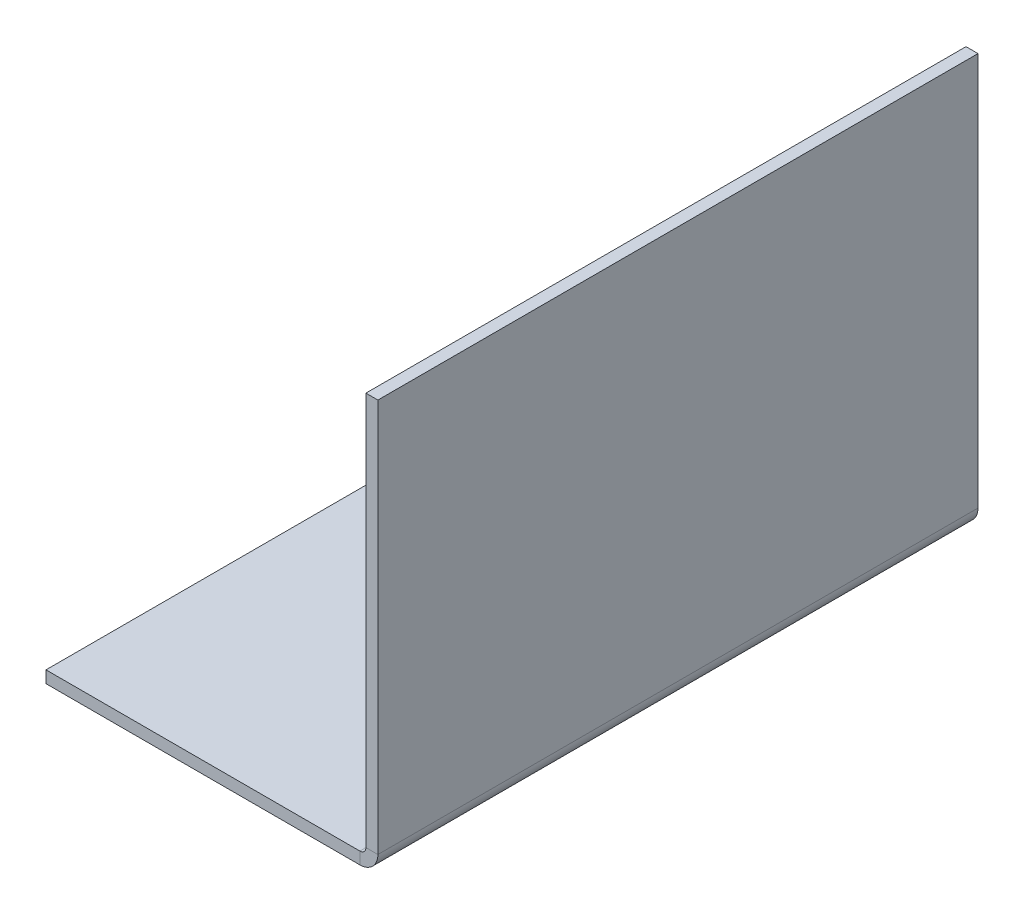
ISO-10303-21;
HEADER;
FILE_DESCRIPTION(('STEP AP214'),'2;1');
FILE_NAME('part.step','',(''),(''),'','','');
FILE_SCHEMA(('AUTOMOTIVE_DESIGN { 1 0 10303 214 1 1 1 1 }'));
ENDSEC;
DATA;
#1=APPLICATION_CONTEXT('core data for automotive mechanical design processes');
#2=APPLICATION_PROTOCOL_DEFINITION('international standard','automotive_design',2000,#1);
#3=PRODUCT_CONTEXT('',#1,'mechanical');
#4=PRODUCT('Part','Part','',(#3));
#5=PRODUCT_RELATED_PRODUCT_CATEGORY('part','',(#4));
#6=PRODUCT_DEFINITION_FORMATION('','',#4);
#7=PRODUCT_DEFINITION_CONTEXT('part definition',#1,'design');
#8=PRODUCT_DEFINITION('design','',#6,#7);
#9=PRODUCT_DEFINITION_SHAPE('','',#8);
#10=(LENGTH_UNIT() NAMED_UNIT(*) SI_UNIT(.MILLI.,.METRE.));
#11=(NAMED_UNIT(*) PLANE_ANGLE_UNIT() SI_UNIT($,.RADIAN.));
#12=(NAMED_UNIT(*) SI_UNIT($,.STERADIAN.) SOLID_ANGLE_UNIT());
#13=UNCERTAINTY_MEASURE_WITH_UNIT(LENGTH_MEASURE(1.E-05),#10,'distance_accuracy_value','');
#14=(GEOMETRIC_REPRESENTATION_CONTEXT(3) GLOBAL_UNCERTAINTY_ASSIGNED_CONTEXT((#13)) GLOBAL_UNIT_ASSIGNED_CONTEXT((#10,
#11,#12)) REPRESENTATION_CONTEXT('',''));
#15=CARTESIAN_POINT('',(0.,0.,0.));
#16=DIRECTION('',(0.,0.,1.));
#17=DIRECTION('',(1.,0.,0.));
#18=AXIS2_PLACEMENT_3D('',#15,#16,#17);
#19=CARTESIAN_POINT('',(0.,0.,100.));
#20=DIRECTION('',(0.,0.,-1.));
#21=DIRECTION('',(0.,1.,0.));
#22=AXIS2_PLACEMENT_3D('',#19,#20,#21);
#23=PLANE('',#22);
#24=DIRECTION('',(-1.,0.,0.));
#25=VECTOR('',#24,1.);
#26=CARTESIAN_POINT('',(0.,1.,100.));
#27=LINE('',#26,#25);
#28=CARTESIAN_POINT('',(2.,1.,100.));
#29=VERTEX_POINT('',#28);
#30=CARTESIAN_POINT('',(0.,1.,100.));
#31=VERTEX_POINT('',#30);
#32=EDGE_CURVE('E11',#29,#31,#27,.T.);
#33=ORIENTED_EDGE('',*,*,#32,.F.);
#34=DIRECTION('',(0.,1.,0.));
#35=VECTOR('',#34,1.);
#36=CARTESIAN_POINT('',(2.,0.,100.));
#37=LINE('',#36,#35);
#38=CARTESIAN_POINT('',(2.,66.585525727806,100.));
#39=VERTEX_POINT('',#38);
#40=EDGE_CURVE('E90',#29,#39,#37,.T.);
#41=ORIENTED_EDGE('',*,*,#40,.T.);
#42=DIRECTION('',(-1.,0.,0.));
#43=VECTOR('',#42,1.);
#44=CARTESIAN_POINT('',(0.,66.585525727806,100.));
#45=LINE('',#44,#43);
#46=CARTESIAN_POINT('',(0.,66.585525727806,100.));
#47=VERTEX_POINT('',#46);
#48=EDGE_CURVE('E50',#39,#47,#45,.T.);
#49=ORIENTED_EDGE('',*,*,#48,.T.);
#50=DIRECTION('',(0.,1.,0.));
#51=VECTOR('',#50,1.);
#52=CARTESIAN_POINT('',(0.,0.,100.));
#53=LINE('',#52,#51);
#54=EDGE_CURVE('E93',#31,#47,#53,.T.);
#55=ORIENTED_EDGE('',*,*,#54,.F.);
#56=EDGE_LOOP('',(#33,#41,#49,#55));
#57=FACE_BOUND('',#56,.T.);
#58=ADVANCED_FACE('F40',(#57),#23,.F.);
#59=CARTESIAN_POINT('',(0.,66.585525727806,0.));
#60=DIRECTION('',(0.,1.,0.));
#61=DIRECTION('',(0.,0.,1.));
#62=AXIS2_PLACEMENT_3D('',#59,#60,#61);
#63=PLANE('',#62);
#64=ORIENTED_EDGE('',*,*,#48,.F.);
#65=DIRECTION('',(0.,0.,-1.));
#66=VECTOR('',#65,1.);
#67=CARTESIAN_POINT('',(2.,66.585525727806,0.));
#68=LINE('',#67,#66);
#69=CARTESIAN_POINT('',(2.,66.585525727806,0.));
#70=VERTEX_POINT('',#69);
#71=EDGE_CURVE('E118',#70,#39,#68,.F.);
#72=ORIENTED_EDGE('',*,*,#71,.F.);
#73=DIRECTION('',(-1.,0.,0.));
#74=VECTOR('',#73,1.);
#75=CARTESIAN_POINT('',(0.,66.585525727806,0.));
#76=LINE('',#75,#74);
#77=CARTESIAN_POINT('',(0.,66.585525727806,0.));
#78=VERTEX_POINT('',#77);
#79=EDGE_CURVE('E136',#70,#78,#76,.T.);
#80=ORIENTED_EDGE('',*,*,#79,.T.);
#81=DIRECTION('',(0.,0.,1.));
#82=VECTOR('',#81,1.);
#83=CARTESIAN_POINT('',(0.,66.585525727806,0.));
#84=LINE('',#83,#82);
#85=EDGE_CURVE('E147',#78,#47,#84,.T.);
#86=ORIENTED_EDGE('',*,*,#85,.T.);
#87=EDGE_LOOP('',(#64,#72,#80,#86));
#88=FACE_BOUND('',#87,.T.);
#89=ADVANCED_FACE('F153',(#88),#63,.T.);
#90=CARTESIAN_POINT('',(0.,0.,0.));
#91=DIRECTION('',(0.,0.,-1.));
#92=DIRECTION('',(0.,1.,0.));
#93=AXIS2_PLACEMENT_3D('',#90,#91,#92);
#94=PLANE('',#93);
#95=ORIENTED_EDGE('',*,*,#79,.F.);
#96=DIRECTION('',(0.,1.,0.));
#97=VECTOR('',#96,1.);
#98=CARTESIAN_POINT('',(2.,0.,0.));
#99=LINE('',#98,#97);
#100=CARTESIAN_POINT('',(2.,1.,0.));
#101=VERTEX_POINT('',#100);
#102=EDGE_CURVE('E178',#101,#70,#99,.T.);
#103=ORIENTED_EDGE('',*,*,#102,.F.);
#104=DIRECTION('',(-1.,0.,0.));
#105=VECTOR('',#104,1.);
#106=CARTESIAN_POINT('',(0.,1.,0.));
#107=LINE('',#106,#105);
#108=CARTESIAN_POINT('',(0.,1.,0.));
#109=VERTEX_POINT('',#108);
#110=EDGE_CURVE('E133',#101,#109,#107,.T.);
#111=ORIENTED_EDGE('',*,*,#110,.T.);
#112=DIRECTION('',(0.,1.,0.));
#113=VECTOR('',#112,1.);
#114=CARTESIAN_POINT('',(0.,0.,0.));
#115=LINE('',#114,#113);
#116=EDGE_CURVE('E154',#109,#78,#115,.T.);
#117=ORIENTED_EDGE('',*,*,#116,.T.);
#118=EDGE_LOOP('',(#95,#103,#111,#117));
#119=FACE_BOUND('',#118,.T.);
#120=ADVANCED_FACE('F184',(#119),#94,.T.);
#121=CARTESIAN_POINT('',(-1.,1.,0.));
#122=DIRECTION('',(0.,0.,-1.));
#123=DIRECTION('',(-1.,0.,0.));
#124=AXIS2_PLACEMENT_3D('',#121,#122,#123);
#125=PLANE('',#124);
#126=ORIENTED_EDGE('',*,*,#110,.F.);
#127=CARTESIAN_POINT('',(-1.,1.,0.));
#128=DIRECTION('',(0.,0.,-1.));
#129=DIRECTION('',(-1.,0.,0.));
#130=AXIS2_PLACEMENT_3D('',#127,#128,#129);
#131=CIRCLE('',#130,3.);
#132=CARTESIAN_POINT('',(-1.,-2.,0.));
#133=VERTEX_POINT('',#132);
#134=EDGE_CURVE('E108',#101,#133,#131,.T.);
#135=ORIENTED_EDGE('',*,*,#134,.T.);
#136=DIRECTION('',(0.,1.,0.));
#137=VECTOR('',#136,1.);
#138=CARTESIAN_POINT('',(-1.,0.,0.));
#139=LINE('',#138,#137);
#140=CARTESIAN_POINT('',(-1.,0.,0.));
#141=VERTEX_POINT('',#140);
#142=EDGE_CURVE('E58',#133,#141,#139,.T.);
#143=ORIENTED_EDGE('',*,*,#142,.T.);
#144=CARTESIAN_POINT('',(-1.,1.,0.));
#145=DIRECTION('',(0.,0.,1.));
#146=DIRECTION('',(1.,0.,0.));
#147=AXIS2_PLACEMENT_3D('',#144,#145,#146);
#148=CIRCLE('',#147,1.);
#149=EDGE_CURVE('E151',#109,#141,#148,.F.);
#150=ORIENTED_EDGE('',*,*,#149,.F.);
#151=EDGE_LOOP('',(#126,#135,#143,#150));
#152=FACE_BOUND('',#151,.T.);
#153=ADVANCED_FACE('F187',(#152),#125,.T.);
#154=CARTESIAN_POINT('',(-53.3038384150787,0.,0.));
#155=DIRECTION('',(0.,0.,-1.));
#156=DIRECTION('',(1.,0.,0.));
#157=AXIS2_PLACEMENT_3D('',#154,#155,#156);
#158=PLANE('',#157);
#159=ORIENTED_EDGE('',*,*,#142,.F.);
#160=DIRECTION('',(1.,0.,0.));
#161=VECTOR('',#160,1.);
#162=CARTESIAN_POINT('',(-53.3038384150787,-2.,0.));
#163=LINE('',#162,#161);
#164=CARTESIAN_POINT('',(-53.3038384150787,-2.,0.));
#165=VERTEX_POINT('',#164);
#166=EDGE_CURVE('E177',#165,#133,#163,.T.);
#167=ORIENTED_EDGE('',*,*,#166,.F.);
#168=DIRECTION('',(0.,1.,0.));
#169=VECTOR('',#168,1.);
#170=CARTESIAN_POINT('',(-53.3038384150787,0.,0.));
#171=LINE('',#170,#169);
#172=CARTESIAN_POINT('',(-53.3038384150787,0.,0.));
#173=VERTEX_POINT('',#172);
#174=EDGE_CURVE('E129',#165,#173,#171,.T.);
#175=ORIENTED_EDGE('',*,*,#174,.T.);
#176=DIRECTION('',(1.,0.,0.));
#177=VECTOR('',#176,1.);
#178=CARTESIAN_POINT('',(-53.3038384150787,0.,0.));
#179=LINE('',#178,#177);
#180=EDGE_CURVE('E161',#173,#141,#179,.T.);
#181=ORIENTED_EDGE('',*,*,#180,.T.);
#182=EDGE_LOOP('',(#159,#167,#175,#181));
#183=FACE_BOUND('',#182,.T.);
#184=ADVANCED_FACE('F198',(#183),#158,.T.);
#185=CARTESIAN_POINT('',(-53.3038384150787,0.,0.));
#186=DIRECTION('',(1.,0.,0.));
#187=DIRECTION('',(0.,0.,1.));
#188=AXIS2_PLACEMENT_3D('',#185,#186,#187);
#189=PLANE('',#188);
#190=ORIENTED_EDGE('',*,*,#174,.F.);
#191=DIRECTION('',(0.,0.,-1.));
#192=VECTOR('',#191,1.);
#193=CARTESIAN_POINT('',(-53.3038384150787,-2.,0.));
#194=LINE('',#193,#192);
#195=CARTESIAN_POINT('',(-53.3038384150787,-2.,100.));
#196=VERTEX_POINT('',#195);
#197=EDGE_CURVE('E113',#165,#196,#194,.F.);
#198=ORIENTED_EDGE('',*,*,#197,.T.);
#199=DIRECTION('',(0.,1.,0.));
#200=VECTOR('',#199,1.);
#201=CARTESIAN_POINT('',(-53.3038384150787,0.,100.));
#202=LINE('',#201,#200);
#203=CARTESIAN_POINT('',(-53.3038384150787,0.,100.));
#204=VERTEX_POINT('',#203);
#205=EDGE_CURVE('E126',#196,#204,#202,.T.);
#206=ORIENTED_EDGE('',*,*,#205,.T.);
#207=DIRECTION('',(0.,0.,1.));
#208=VECTOR('',#207,1.);
#209=CARTESIAN_POINT('',(-53.3038384150787,0.,0.));
#210=LINE('',#209,#208);
#211=EDGE_CURVE('E164',#173,#204,#210,.T.);
#212=ORIENTED_EDGE('',*,*,#211,.F.);
#213=EDGE_LOOP('',(#190,#198,#206,#212));
#214=FACE_BOUND('',#213,.T.);
#215=ADVANCED_FACE('F204',(#214),#189,.F.);
#216=CARTESIAN_POINT('',(-53.3038384150787,0.,100.));
#217=DIRECTION('',(0.,0.,-1.));
#218=DIRECTION('',(1.,0.,0.));
#219=AXIS2_PLACEMENT_3D('',#216,#217,#218);
#220=PLANE('',#219);
#221=ORIENTED_EDGE('',*,*,#205,.F.);
#222=DIRECTION('',(1.,0.,0.));
#223=VECTOR('',#222,1.);
#224=CARTESIAN_POINT('',(-53.3038384150787,-2.,100.));
#225=LINE('',#224,#223);
#226=CARTESIAN_POINT('',(-1.,-2.,100.));
#227=VERTEX_POINT('',#226);
#228=EDGE_CURVE('E175',#196,#227,#225,.T.);
#229=ORIENTED_EDGE('',*,*,#228,.T.);
#230=DIRECTION('',(0.,1.,0.));
#231=VECTOR('',#230,1.);
#232=CARTESIAN_POINT('',(-1.,0.,100.));
#233=LINE('',#232,#231);
#234=CARTESIAN_POINT('',(-1.,0.,100.));
#235=VERTEX_POINT('',#234);
#236=EDGE_CURVE('E44',#227,#235,#233,.T.);
#237=ORIENTED_EDGE('',*,*,#236,.T.);
#238=DIRECTION('',(1.,0.,0.));
#239=VECTOR('',#238,1.);
#240=CARTESIAN_POINT('',(-53.3038384150787,0.,100.));
#241=LINE('',#240,#239);
#242=EDGE_CURVE('E156',#204,#235,#241,.T.);
#243=ORIENTED_EDGE('',*,*,#242,.F.);
#244=EDGE_LOOP('',(#221,#229,#237,#243));
#245=FACE_BOUND('',#244,.T.);
#246=ADVANCED_FACE('F208',(#245),#220,.F.);
#247=CARTESIAN_POINT('',(-1.,1.,100.));
#248=DIRECTION('',(0.,0.,1.));
#249=DIRECTION('',(1.,0.,0.));
#250=AXIS2_PLACEMENT_3D('',#247,#248,#249);
#251=PLANE('',#250);
#252=CARTESIAN_POINT('',(-1.,1.,100.));
#253=DIRECTION('',(0.,0.,-1.));
#254=DIRECTION('',(-1.,0.,0.));
#255=AXIS2_PLACEMENT_3D('',#252,#253,#254);
#256=CIRCLE('',#255,3.);
#257=EDGE_CURVE('E106',#227,#29,#256,.F.);
#258=ORIENTED_EDGE('',*,*,#257,.T.);
#259=ORIENTED_EDGE('',*,*,#32,.T.);
#260=CARTESIAN_POINT('',(-1.,1.,100.));
#261=DIRECTION('',(0.,0.,-1.));
#262=DIRECTION('',(-1.,0.,0.));
#263=AXIS2_PLACEMENT_3D('',#260,#261,#262);
#264=CIRCLE('',#263,1.);
#265=EDGE_CURVE('E171',#235,#31,#264,.F.);
#266=ORIENTED_EDGE('',*,*,#265,.F.);
#267=ORIENTED_EDGE('',*,*,#236,.F.);
#268=EDGE_LOOP('',(#258,#259,#266,#267));
#269=FACE_BOUND('',#268,.T.);
#270=ADVANCED_FACE('F42',(#269),#251,.T.);
#271=CARTESIAN_POINT('',(-53.3038384150787,0.,0.));
#272=DIRECTION('',(0.,-1.,0.));
#273=DIRECTION('',(0.,0.,-1.));
#274=AXIS2_PLACEMENT_3D('',#271,#272,#273);
#275=PLANE('',#274);
#276=ORIENTED_EDGE('',*,*,#242,.T.);
#277=DIRECTION('',(0.,0.,1.));
#278=VECTOR('',#277,1.);
#279=CARTESIAN_POINT('',(-1.,0.,0.));
#280=LINE('',#279,#278);
#281=EDGE_CURVE('E168',#235,#141,#280,.F.);
#282=ORIENTED_EDGE('',*,*,#281,.T.);
#283=ORIENTED_EDGE('',*,*,#180,.F.);
#284=ORIENTED_EDGE('',*,*,#211,.T.);
#285=EDGE_LOOP('',(#276,#282,#283,#284));
#286=FACE_BOUND('',#285,.T.);
#287=ADVANCED_FACE('F203',(#286),#275,.F.);
#288=CARTESIAN_POINT('',(0.,0.,0.));
#289=DIRECTION('',(1.,0.,0.));
#290=DIRECTION('',(0.,0.,-1.));
#291=AXIS2_PLACEMENT_3D('',#288,#289,#290);
#292=PLANE('',#291);
#293=ORIENTED_EDGE('',*,*,#116,.F.);
#294=DIRECTION('',(0.,0.,1.));
#295=VECTOR('',#294,1.);
#296=CARTESIAN_POINT('',(0.,1.,100.));
#297=LINE('',#296,#295);
#298=EDGE_CURVE('E150',#109,#31,#297,.T.);
#299=ORIENTED_EDGE('',*,*,#298,.T.);
#300=ORIENTED_EDGE('',*,*,#54,.T.);
#301=ORIENTED_EDGE('',*,*,#85,.F.);
#302=EDGE_LOOP('',(#293,#299,#300,#301));
#303=FACE_BOUND('',#302,.T.);
#304=ADVANCED_FACE('F146',(#303),#292,.F.);
#305=CARTESIAN_POINT('',(-1.,1.,0.));
#306=DIRECTION('',(0.,0.,-1.));
#307=DIRECTION('',(-1.,0.,0.));
#308=AXIS2_PLACEMENT_3D('',#305,#306,#307);
#309=CYLINDRICAL_SURFACE('',#308,1.);
#310=ORIENTED_EDGE('',*,*,#149,.T.);
#311=ORIENTED_EDGE('',*,*,#281,.F.);
#312=ORIENTED_EDGE('',*,*,#265,.T.);
#313=ORIENTED_EDGE('',*,*,#298,.F.);
#314=EDGE_LOOP('',(#310,#311,#312,#313));
#315=FACE_BOUND('',#314,.T.);
#316=ADVANCED_FACE('F190',(#315),#309,.F.);
#317=CARTESIAN_POINT('',(-53.3038384150787,-2.,0.));
#318=DIRECTION('',(0.,-1.,0.));
#319=DIRECTION('',(0.,0.,-1.));
#320=AXIS2_PLACEMENT_3D('',#317,#318,#319);
#321=PLANE('',#320);
#322=ORIENTED_EDGE('',*,*,#228,.F.);
#323=ORIENTED_EDGE('',*,*,#197,.F.);
#324=ORIENTED_EDGE('',*,*,#166,.T.);
#325=DIRECTION('',(0.,0.,-1.));
#326=VECTOR('',#325,1.);
#327=CARTESIAN_POINT('',(-1.,-2.,0.));
#328=LINE('',#327,#326);
#329=EDGE_CURVE('E112',#227,#133,#328,.T.);
#330=ORIENTED_EDGE('',*,*,#329,.F.);
#331=EDGE_LOOP('',(#322,#323,#324,#330));
#332=FACE_BOUND('',#331,.T.);
#333=ADVANCED_FACE('F210',(#332),#321,.T.);
#334=CARTESIAN_POINT('',(2.,0.,0.));
#335=DIRECTION('',(1.,0.,0.));
#336=DIRECTION('',(0.,0.,-1.));
#337=AXIS2_PLACEMENT_3D('',#334,#335,#336);
#338=PLANE('',#337);
#339=ORIENTED_EDGE('',*,*,#102,.T.);
#340=ORIENTED_EDGE('',*,*,#71,.T.);
#341=ORIENTED_EDGE('',*,*,#40,.F.);
#342=DIRECTION('',(0.,0.,-1.));
#343=VECTOR('',#342,1.);
#344=CARTESIAN_POINT('',(2.,1.,0.));
#345=LINE('',#344,#343);
#346=EDGE_CURVE('E103',#101,#29,#345,.F.);
#347=ORIENTED_EDGE('',*,*,#346,.F.);
#348=EDGE_LOOP('',(#339,#340,#341,#347));
#349=FACE_BOUND('',#348,.T.);
#350=ADVANCED_FACE('F116',(#349),#338,.T.);
#351=CARTESIAN_POINT('',(-1.,1.,0.));
#352=DIRECTION('',(0.,0.,-1.));
#353=DIRECTION('',(-1.,0.,0.));
#354=AXIS2_PLACEMENT_3D('',#351,#352,#353);
#355=CYLINDRICAL_SURFACE('',#354,3.);
#356=ORIENTED_EDGE('',*,*,#134,.F.);
#357=ORIENTED_EDGE('',*,*,#346,.T.);
#358=ORIENTED_EDGE('',*,*,#257,.F.);
#359=ORIENTED_EDGE('',*,*,#329,.T.);
#360=EDGE_LOOP('',(#356,#357,#358,#359));
#361=FACE_BOUND('',#360,.T.);
#362=ADVANCED_FACE('F104',(#361),#355,.T.);
#363=CLOSED_SHELL('',(#58,#89,#120,#153,#184,#215,#246,#270,#287,#304,#316,#333,#350,#362));
#364=MANIFOLD_SOLID_BREP('B2',#363);
#365=ADVANCED_BREP_SHAPE_REPRESENTATION('',(#18,#364),#14);
#366=SHAPE_DEFINITION_REPRESENTATION(#9,#365);
ENDSEC;
END-ISO-10303-21;
